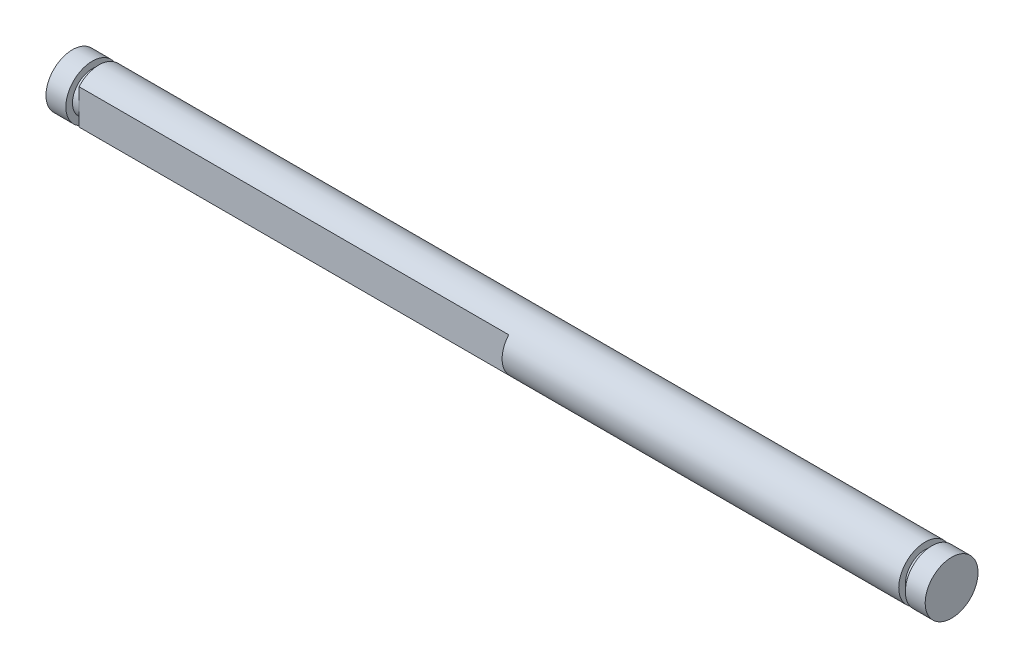
ISO-10303-21;
HEADER;
FILE_DESCRIPTION(('STEP AP214'),'2;1');
FILE_NAME('part.step','',(''),(''),'','','');
FILE_SCHEMA(('AUTOMOTIVE_DESIGN { 1 0 10303 214 1 1 1 1 }'));
ENDSEC;
DATA;
#1=APPLICATION_CONTEXT('core data for automotive mechanical design processes');
#2=APPLICATION_PROTOCOL_DEFINITION('international standard','automotive_design',2000,#1);
#3=PRODUCT_CONTEXT('',#1,'mechanical');
#4=PRODUCT('Part','Part','',(#3));
#5=PRODUCT_RELATED_PRODUCT_CATEGORY('part','',(#4));
#6=PRODUCT_DEFINITION_FORMATION('','',#4);
#7=PRODUCT_DEFINITION_CONTEXT('part definition',#1,'design');
#8=PRODUCT_DEFINITION('design','',#6,#7);
#9=PRODUCT_DEFINITION_SHAPE('','',#8);
#10=(LENGTH_UNIT() NAMED_UNIT(*) SI_UNIT(.MILLI.,.METRE.));
#11=(NAMED_UNIT(*) PLANE_ANGLE_UNIT() SI_UNIT($,.RADIAN.));
#12=(NAMED_UNIT(*) SI_UNIT($,.STERADIAN.) SOLID_ANGLE_UNIT());
#13=UNCERTAINTY_MEASURE_WITH_UNIT(LENGTH_MEASURE(1.E-05),#10,'distance_accuracy_value','');
#14=(GEOMETRIC_REPRESENTATION_CONTEXT(3) GLOBAL_UNCERTAINTY_ASSIGNED_CONTEXT((#13)) GLOBAL_UNIT_ASSIGNED_CONTEXT((#10,
#11,#12)) REPRESENTATION_CONTEXT('',''));
#15=CARTESIAN_POINT('',(0.,0.,0.));
#16=DIRECTION('',(0.,0.,1.));
#17=DIRECTION('',(1.,0.,0.));
#18=AXIS2_PLACEMENT_3D('',#15,#16,#17);
#19=CARTESIAN_POINT('',(-66.5,0.,0.));
#20=DIRECTION('',(1.,0.,0.));
#21=DIRECTION('',(0.,0.,-1.));
#22=AXIS2_PLACEMENT_3D('',#19,#20,#21);
#23=PLANE('',#22);
#24=CARTESIAN_POINT('',(-66.5,0.,0.));
#25=DIRECTION('',(-1.,0.,0.));
#26=DIRECTION('',(0.,0.,1.));
#27=AXIS2_PLACEMENT_3D('',#24,#25,#26);
#28=CIRCLE('',#27,4.);
#29=CARTESIAN_POINT('',(-66.5,0.,4.));
#30=VERTEX_POINT('',#29);
#31=EDGE_CURVE('E64',#30,#30,#28,.T.);
#32=ORIENTED_EDGE('',*,*,#31,.T.);
#33=EDGE_LOOP('',(#32));
#34=FACE_BOUND('',#33,.T.);
#35=ADVANCED_FACE('F33',(#34),#23,.F.);
#36=CARTESIAN_POINT('',(-66.5,0.,0.));
#37=DIRECTION('',(-1.,0.,0.));
#38=DIRECTION('',(0.,0.,1.));
#39=AXIS2_PLACEMENT_3D('',#36,#37,#38);
#40=CYLINDRICAL_SURFACE('',#39,4.);
#41=ORIENTED_EDGE('',*,*,#31,.F.);
#42=EDGE_LOOP('',(#41));
#43=FACE_BOUND('',#42,.T.);
#44=CARTESIAN_POINT('',(-63.5,0.,0.));
#45=DIRECTION('',(-1.,0.,0.));
#46=DIRECTION('',(0.,0.,1.));
#47=AXIS2_PLACEMENT_3D('',#44,#45,#46);
#48=CIRCLE('',#47,4.);
#49=CARTESIAN_POINT('',(-63.5,0.,4.));
#50=VERTEX_POINT('',#49);
#51=EDGE_CURVE('E89',#50,#50,#48,.T.);
#52=ORIENTED_EDGE('',*,*,#51,.T.);
#53=EDGE_LOOP('',(#52));
#54=FACE_BOUND('',#53,.T.);
#55=ADVANCED_FACE('F96',(#43,#54),#40,.T.);
#56=CARTESIAN_POINT('',(-63.5,0.,-4.));
#57=DIRECTION('',(-1.,0.,0.));
#58=DIRECTION('',(0.,0.,1.));
#59=AXIS2_PLACEMENT_3D('',#56,#57,#58);
#60=PLANE('',#59);
#61=ORIENTED_EDGE('',*,*,#51,.F.);
#62=EDGE_LOOP('',(#61));
#63=FACE_BOUND('',#62,.T.);
#64=CARTESIAN_POINT('',(-63.5,0.,0.));
#65=DIRECTION('',(-1.,0.,0.));
#66=DIRECTION('',(0.,0.,1.));
#67=AXIS2_PLACEMENT_3D('',#64,#65,#66);
#68=CIRCLE('',#67,3.00000000000002);
#69=CARTESIAN_POINT('',(-63.5,0.,3.00000000000002));
#70=VERTEX_POINT('',#69);
#71=EDGE_CURVE('E80',#70,#70,#68,.T.);
#72=ORIENTED_EDGE('',*,*,#71,.T.);
#73=EDGE_LOOP('',(#72));
#74=FACE_BOUND('',#73,.T.);
#75=ADVANCED_FACE('F99',(#63,#74),#60,.F.);
#76=CARTESIAN_POINT('',(-66.5,0.,0.));
#77=DIRECTION('',(-1.,0.,0.));
#78=DIRECTION('',(0.,0.,1.));
#79=AXIS2_PLACEMENT_3D('',#76,#77,#78);
#80=CYLINDRICAL_SURFACE('',#79,3.00000000000001);
#81=ORIENTED_EDGE('',*,*,#71,.F.);
#82=EDGE_LOOP('',(#81));
#83=FACE_BOUND('',#82,.T.);
#84=CARTESIAN_POINT('',(-62.5,0.,0.));
#85=DIRECTION('',(-1.,0.,0.));
#86=DIRECTION('',(0.,0.,1.));
#87=AXIS2_PLACEMENT_3D('',#84,#85,#86);
#88=CIRCLE('',#87,3.);
#89=CARTESIAN_POINT('',(-62.5,0.,3.00000000000001));
#90=VERTEX_POINT('',#89);
#91=EDGE_CURVE('E76',#90,#90,#88,.T.);
#92=ORIENTED_EDGE('',*,*,#91,.T.);
#93=EDGE_LOOP('',(#92));
#94=FACE_BOUND('',#93,.T.);
#95=ADVANCED_FACE('F104',(#83,#94),#80,.T.);
#96=CARTESIAN_POINT('',(-62.5,0.,-3.));
#97=DIRECTION('',(1.,0.,0.));
#98=DIRECTION('',(0.,0.,-1.));
#99=AXIS2_PLACEMENT_3D('',#96,#97,#98);
#100=PLANE('',#99);
#101=CARTESIAN_POINT('',(-62.5,0.,0.));
#102=DIRECTION('',(-1.,0.,0.));
#103=DIRECTION('',(0.,0.,1.));
#104=AXIS2_PLACEMENT_3D('',#101,#102,#103);
#105=CIRCLE('',#104,4.00000000000002);
#106=CARTESIAN_POINT('',(-62.5,2.6457513110646,3.00000000000001));
#107=VERTEX_POINT('',#106);
#108=CARTESIAN_POINT('',(-62.5,-2.6457513110646,3.00000000000001));
#109=VERTEX_POINT('',#108);
#110=EDGE_CURVE('E73',#107,#109,#105,.T.);
#111=ORIENTED_EDGE('',*,*,#110,.T.);
#112=DIRECTION('',(0.,1.,0.));
#113=VECTOR('',#112,1.);
#114=CARTESIAN_POINT('',(-62.5,-4.00000000000002,3.00000000000001));
#115=LINE('',#114,#113);
#116=EDGE_CURVE('E113',#109,#90,#115,.T.);
#117=ORIENTED_EDGE('',*,*,#116,.T.);
#118=ORIENTED_EDGE('',*,*,#91,.F.);
#119=EDGE_CURVE('E67',#90,#107,#115,.T.);
#120=ORIENTED_EDGE('',*,*,#119,.T.);
#121=EDGE_LOOP('',(#111,#117,#118,#120));
#122=FACE_BOUND('',#121,.T.);
#123=ADVANCED_FACE('F110',(#122),#100,.F.);
#124=CARTESIAN_POINT('',(-66.5,0.,0.));
#125=DIRECTION('',(-1.,0.,0.));
#126=DIRECTION('',(0.,0.,1.));
#127=AXIS2_PLACEMENT_3D('',#124,#125,#126);
#128=CYLINDRICAL_SURFACE('',#127,4.00000000000001);
#129=ORIENTED_EDGE('',*,*,#110,.F.);
#130=DIRECTION('',(-1.,0.,0.));
#131=VECTOR('',#130,1.);
#132=CARTESIAN_POINT('',(-66.5,2.6457513110646,3.00000000000001));
#133=LINE('',#132,#131);
#134=CARTESIAN_POINT('',(2.5,2.64575131106458,3.00000000000001));
#135=VERTEX_POINT('',#134);
#136=EDGE_CURVE('E11',#107,#135,#133,.F.);
#137=ORIENTED_EDGE('',*,*,#136,.T.);
#138=CARTESIAN_POINT('',(2.5,0.,0.));
#139=DIRECTION('',(1.,0.,0.));
#140=DIRECTION('',(0.,0.,-1.));
#141=AXIS2_PLACEMENT_3D('',#138,#139,#140);
#142=CIRCLE('',#141,4.00000000000001);
#143=CARTESIAN_POINT('',(2.5,-2.64575131106458,3.00000000000001));
#144=VERTEX_POINT('',#143);
#145=EDGE_CURVE('E60',#135,#144,#142,.T.);
#146=ORIENTED_EDGE('',*,*,#145,.T.);
#147=DIRECTION('',(-1.,0.,0.));
#148=VECTOR('',#147,1.);
#149=CARTESIAN_POINT('',(-66.5,-2.6457513110646,3.00000000000001));
#150=LINE('',#149,#148);
#151=EDGE_CURVE('E40',#144,#109,#150,.T.);
#152=ORIENTED_EDGE('',*,*,#151,.T.);
#153=EDGE_LOOP('',(#129,#137,#146,#152));
#154=FACE_BOUND('',#153,.T.);
#155=CARTESIAN_POINT('',(62.5,0.,0.));
#156=DIRECTION('',(-1.,0.,0.));
#157=DIRECTION('',(0.,0.,1.));
#158=AXIS2_PLACEMENT_3D('',#155,#156,#157);
#159=CIRCLE('',#158,4.);
#160=CARTESIAN_POINT('',(62.5,0.,3.99999999999998));
#161=VERTEX_POINT('',#160);
#162=EDGE_CURVE('E77',#161,#161,#159,.T.);
#163=ORIENTED_EDGE('',*,*,#162,.T.);
#164=EDGE_LOOP('',(#163));
#165=FACE_BOUND('',#164,.T.);
#166=ADVANCED_FACE('F70',(#154,#165),#128,.T.);
#167=CARTESIAN_POINT('',(62.5,0.,-4.00000000000002));
#168=DIRECTION('',(-1.,0.,0.));
#169=DIRECTION('',(0.,0.,1.));
#170=AXIS2_PLACEMENT_3D('',#167,#168,#169);
#171=PLANE('',#170);
#172=ORIENTED_EDGE('',*,*,#162,.F.);
#173=EDGE_LOOP('',(#172));
#174=FACE_BOUND('',#173,.T.);
#175=CARTESIAN_POINT('',(62.5,0.,0.));
#176=DIRECTION('',(-1.,0.,0.));
#177=DIRECTION('',(0.,0.,1.));
#178=AXIS2_PLACEMENT_3D('',#175,#176,#177);
#179=CIRCLE('',#178,3.00000000000005);
#180=CARTESIAN_POINT('',(62.5,0.,3.00000000000003));
#181=VERTEX_POINT('',#180);
#182=EDGE_CURVE('E83',#181,#181,#179,.T.);
#183=ORIENTED_EDGE('',*,*,#182,.T.);
#184=EDGE_LOOP('',(#183));
#185=FACE_BOUND('',#184,.T.);
#186=ADVANCED_FACE('F127',(#174,#185),#171,.F.);
#187=CARTESIAN_POINT('',(-66.5,0.,0.));
#188=DIRECTION('',(-1.,0.,0.));
#189=DIRECTION('',(0.,0.,1.));
#190=AXIS2_PLACEMENT_3D('',#187,#188,#189);
#191=CYLINDRICAL_SURFACE('',#190,3.00000000000003);
#192=ORIENTED_EDGE('',*,*,#182,.F.);
#193=EDGE_LOOP('',(#192));
#194=FACE_BOUND('',#193,.T.);
#195=CARTESIAN_POINT('',(63.5,0.,0.));
#196=DIRECTION('',(-1.,0.,0.));
#197=DIRECTION('',(0.,0.,1.));
#198=AXIS2_PLACEMENT_3D('',#195,#196,#197);
#199=CIRCLE('',#198,3.);
#200=CARTESIAN_POINT('',(63.5,0.,2.99999999999998));
#201=VERTEX_POINT('',#200);
#202=EDGE_CURVE('E122',#201,#201,#199,.T.);
#203=ORIENTED_EDGE('',*,*,#202,.T.);
#204=EDGE_LOOP('',(#203));
#205=FACE_BOUND('',#204,.T.);
#206=ADVANCED_FACE('F129',(#194,#205),#191,.T.);
#207=CARTESIAN_POINT('',(63.5,0.,-3.00000000000002));
#208=DIRECTION('',(1.,0.,0.));
#209=DIRECTION('',(0.,0.,-1.));
#210=AXIS2_PLACEMENT_3D('',#207,#208,#209);
#211=PLANE('',#210);
#212=ORIENTED_EDGE('',*,*,#202,.F.);
#213=EDGE_LOOP('',(#212));
#214=FACE_BOUND('',#213,.T.);
#215=CARTESIAN_POINT('',(63.5,0.,0.));
#216=DIRECTION('',(-1.,0.,0.));
#217=DIRECTION('',(0.,0.,1.));
#218=AXIS2_PLACEMENT_3D('',#215,#216,#217);
#219=CIRCLE('',#218,3.99999999999998);
#220=CARTESIAN_POINT('',(63.5,0.,3.99999999999995));
#221=VERTEX_POINT('',#220);
#222=EDGE_CURVE('E117',#221,#221,#219,.T.);
#223=ORIENTED_EDGE('',*,*,#222,.T.);
#224=EDGE_LOOP('',(#223));
#225=FACE_BOUND('',#224,.T.);
#226=ADVANCED_FACE('F132',(#214,#225),#211,.F.);
#227=CARTESIAN_POINT('',(-66.5,0.,0.));
#228=DIRECTION('',(-1.,0.,0.));
#229=DIRECTION('',(0.,0.,1.));
#230=AXIS2_PLACEMENT_3D('',#227,#228,#229);
#231=CYLINDRICAL_SURFACE('',#230,3.99999999999999);
#232=ORIENTED_EDGE('',*,*,#222,.F.);
#233=EDGE_LOOP('',(#232));
#234=FACE_BOUND('',#233,.T.);
#235=CARTESIAN_POINT('',(66.5,0.,0.));
#236=DIRECTION('',(-1.,0.,0.));
#237=DIRECTION('',(0.,0.,1.));
#238=AXIS2_PLACEMENT_3D('',#235,#236,#237);
#239=CIRCLE('',#238,4.);
#240=CARTESIAN_POINT('',(66.5,0.,3.99999999999998));
#241=VERTEX_POINT('',#240);
#242=EDGE_CURVE('E114',#241,#241,#239,.T.);
#243=ORIENTED_EDGE('',*,*,#242,.T.);
#244=EDGE_LOOP('',(#243));
#245=FACE_BOUND('',#244,.T.);
#246=ADVANCED_FACE('F138',(#234,#245),#231,.T.);
#247=CARTESIAN_POINT('',(66.5,0.,-4.00000000000002));
#248=DIRECTION('',(-1.,0.,0.));
#249=DIRECTION('',(0.,0.,1.));
#250=AXIS2_PLACEMENT_3D('',#247,#248,#249);
#251=PLANE('',#250);
#252=ORIENTED_EDGE('',*,*,#242,.F.);
#253=EDGE_LOOP('',(#252));
#254=FACE_BOUND('',#253,.T.);
#255=ADVANCED_FACE('F144',(#254),#251,.F.);
#256=CARTESIAN_POINT('',(-62.5,-4.00000000000002,3.00000000000001));
#257=DIRECTION('',(0.,0.,-1.));
#258=DIRECTION('',(-1.,0.,0.));
#259=AXIS2_PLACEMENT_3D('',#256,#257,#258);
#260=PLANE('',#259);
#261=DIRECTION('',(0.,1.,0.));
#262=VECTOR('',#261,1.);
#263=CARTESIAN_POINT('',(2.5,-4.00000000000002,3.00000000000001));
#264=LINE('',#263,#262);
#265=EDGE_CURVE('E46',#144,#135,#264,.T.);
#266=ORIENTED_EDGE('',*,*,#265,.T.);
#267=ORIENTED_EDGE('',*,*,#136,.F.);
#268=ORIENTED_EDGE('',*,*,#119,.F.);
#269=ORIENTED_EDGE('',*,*,#116,.F.);
#270=ORIENTED_EDGE('',*,*,#151,.F.);
#271=EDGE_LOOP('',(#266,#267,#268,#269,#270));
#272=FACE_BOUND('',#271,.T.);
#273=ADVANCED_FACE('F66',(#272),#260,.F.);
#274=CARTESIAN_POINT('',(2.5,-4.00000000000002,4.00000000000001));
#275=DIRECTION('',(1.,0.,0.));
#276=DIRECTION('',(0.,0.,-1.));
#277=AXIS2_PLACEMENT_3D('',#274,#275,#276);
#278=PLANE('',#277);
#279=ORIENTED_EDGE('',*,*,#265,.F.);
#280=ORIENTED_EDGE('',*,*,#145,.F.);
#281=EDGE_LOOP('',(#279,#280));
#282=FACE_BOUND('',#281,.T.);
#283=ADVANCED_FACE('F61',(#282),#278,.F.);
#284=CLOSED_SHELL('',(#35,#55,#75,#95,#123,#166,#186,#206,#226,#246,#255,#273,#283));
#285=MANIFOLD_SOLID_BREP('B2',#284);
#286=ADVANCED_BREP_SHAPE_REPRESENTATION('',(#18,#285),#14);
#287=SHAPE_DEFINITION_REPRESENTATION(#9,#286);
ENDSEC;
END-ISO-10303-21;
